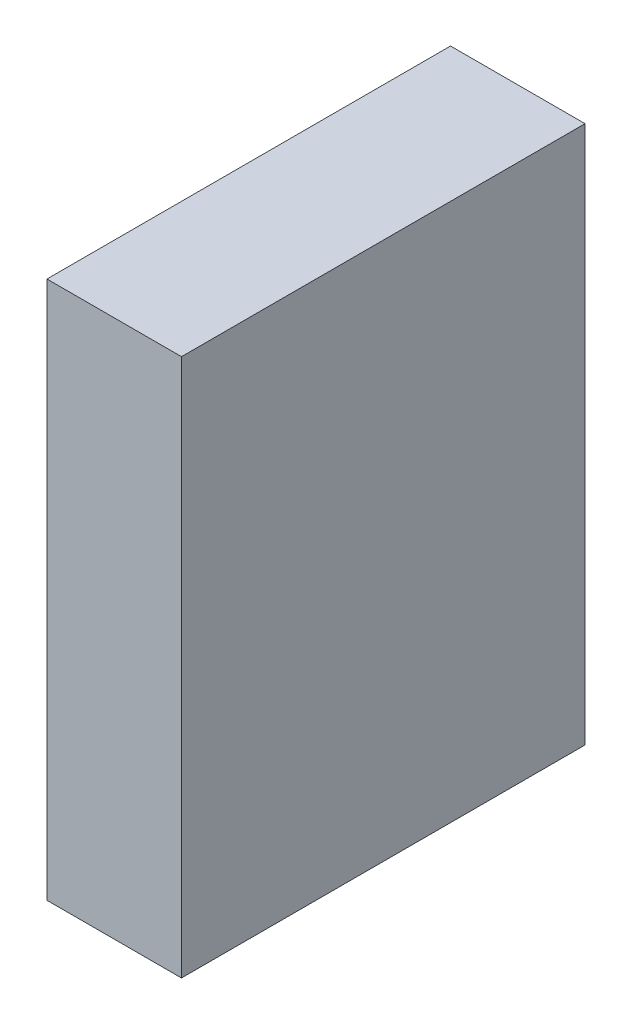
ISO-10303-21;
HEADER;
FILE_DESCRIPTION(('STEP AP214'),'2;1');
FILE_NAME('part.step','',(''),(''),'','','');
FILE_SCHEMA(('AUTOMOTIVE_DESIGN { 1 0 10303 214 1 1 1 1 }'));
ENDSEC;
DATA;
#1=APPLICATION_CONTEXT('core data for automotive mechanical design processes');
#2=APPLICATION_PROTOCOL_DEFINITION('international standard','automotive_design',2000,#1);
#3=PRODUCT_CONTEXT('',#1,'mechanical');
#4=PRODUCT('Part','Part','',(#3));
#5=PRODUCT_RELATED_PRODUCT_CATEGORY('part','',(#4));
#6=PRODUCT_DEFINITION_FORMATION('','',#4);
#7=PRODUCT_DEFINITION_CONTEXT('part definition',#1,'design');
#8=PRODUCT_DEFINITION('design','',#6,#7);
#9=PRODUCT_DEFINITION_SHAPE('','',#8);
#10=(LENGTH_UNIT() NAMED_UNIT(*) SI_UNIT(.MILLI.,.METRE.));
#11=(NAMED_UNIT(*) PLANE_ANGLE_UNIT() SI_UNIT($,.RADIAN.));
#12=(NAMED_UNIT(*) SI_UNIT($,.STERADIAN.) SOLID_ANGLE_UNIT());
#13=UNCERTAINTY_MEASURE_WITH_UNIT(LENGTH_MEASURE(1.E-05),#10,'distance_accuracy_value','');
#14=(GEOMETRIC_REPRESENTATION_CONTEXT(3) GLOBAL_UNCERTAINTY_ASSIGNED_CONTEXT((#13)) GLOBAL_UNIT_ASSIGNED_CONTEXT((#10,
#11,#12)) REPRESENTATION_CONTEXT('',''));
#15=CARTESIAN_POINT('',(0.,0.,0.));
#16=DIRECTION('',(0.,0.,1.));
#17=DIRECTION('',(1.,0.,0.));
#18=AXIS2_PLACEMENT_3D('',#15,#16,#17);
#19=CARTESIAN_POINT('',(125.,500.,750.));
#20=DIRECTION('',(0.,-1.,0.));
#21=DIRECTION('',(0.,0.,-1.));
#22=AXIS2_PLACEMENT_3D('',#19,#20,#21);
#23=PLANE('',#22);
#24=DIRECTION('',(-1.,0.,0.));
#25=VECTOR('',#24,1.);
#26=CARTESIAN_POINT('',(125.,500.,0.));
#27=LINE('',#26,#25);
#28=CARTESIAN_POINT('',(125.,500.,0.));
#29=VERTEX_POINT('',#28);
#30=CARTESIAN_POINT('',(-125.,500.,0.));
#31=VERTEX_POINT('',#30);
#32=EDGE_CURVE('E105',#29,#31,#27,.T.);
#33=ORIENTED_EDGE('',*,*,#32,.T.);
#34=DIRECTION('',(0.,0.,-1.));
#35=VECTOR('',#34,1.);
#36=CARTESIAN_POINT('',(-125.,500.,750.));
#37=LINE('',#36,#35);
#38=CARTESIAN_POINT('',(-125.,500.,750.));
#39=VERTEX_POINT('',#38);
#40=EDGE_CURVE('E11',#39,#31,#37,.T.);
#41=ORIENTED_EDGE('',*,*,#40,.F.);
#42=DIRECTION('',(-1.,0.,0.));
#43=VECTOR('',#42,1.);
#44=CARTESIAN_POINT('',(125.,500.,750.));
#45=LINE('',#44,#43);
#46=CARTESIAN_POINT('',(125.,500.,750.));
#47=VERTEX_POINT('',#46);
#48=EDGE_CURVE('E89',#47,#39,#45,.T.);
#49=ORIENTED_EDGE('',*,*,#48,.F.);
#50=DIRECTION('',(0.,0.,-1.));
#51=VECTOR('',#50,1.);
#52=CARTESIAN_POINT('',(125.,500.,750.));
#53=LINE('',#52,#51);
#54=EDGE_CURVE('E97',#47,#29,#53,.T.);
#55=ORIENTED_EDGE('',*,*,#54,.T.);
#56=EDGE_LOOP('',(#33,#41,#49,#55));
#57=FACE_BOUND('',#56,.T.);
#58=ADVANCED_FACE('F39',(#57),#23,.F.);
#59=CARTESIAN_POINT('',(-125.,-500.,750.));
#60=DIRECTION('',(1.,0.,0.));
#61=DIRECTION('',(0.,0.,-1.));
#62=AXIS2_PLACEMENT_3D('',#59,#60,#61);
#63=PLANE('',#62);
#64=DIRECTION('',(0.,-1.,0.));
#65=VECTOR('',#64,1.);
#66=CARTESIAN_POINT('',(-125.,-500.,0.));
#67=LINE('',#66,#65);
#68=CARTESIAN_POINT('',(-125.,-500.,0.));
#69=VERTEX_POINT('',#68);
#70=EDGE_CURVE('E92',#31,#69,#67,.T.);
#71=ORIENTED_EDGE('',*,*,#70,.T.);
#72=DIRECTION('',(0.,0.,-1.));
#73=VECTOR('',#72,1.);
#74=CARTESIAN_POINT('',(-125.,-500.,750.));
#75=LINE('',#74,#73);
#76=CARTESIAN_POINT('',(-125.,-500.,750.));
#77=VERTEX_POINT('',#76);
#78=EDGE_CURVE('E50',#77,#69,#75,.T.);
#79=ORIENTED_EDGE('',*,*,#78,.F.);
#80=DIRECTION('',(0.,-1.,0.));
#81=VECTOR('',#80,1.);
#82=CARTESIAN_POINT('',(-125.,-500.,750.));
#83=LINE('',#82,#81);
#84=EDGE_CURVE('E82',#39,#77,#83,.T.);
#85=ORIENTED_EDGE('',*,*,#84,.F.);
#86=ORIENTED_EDGE('',*,*,#40,.T.);
#87=EDGE_LOOP('',(#71,#79,#85,#86));
#88=FACE_BOUND('',#87,.T.);
#89=ADVANCED_FACE('F93',(#88),#63,.F.);
#90=CARTESIAN_POINT('',(125.,-500.,750.));
#91=DIRECTION('',(0.,1.,0.));
#92=DIRECTION('',(0.,0.,1.));
#93=AXIS2_PLACEMENT_3D('',#90,#91,#92);
#94=PLANE('',#93);
#95=DIRECTION('',(1.,0.,0.));
#96=VECTOR('',#95,1.);
#97=CARTESIAN_POINT('',(125.,-500.,0.));
#98=LINE('',#97,#96);
#99=CARTESIAN_POINT('',(125.,-500.,0.));
#100=VERTEX_POINT('',#99);
#101=EDGE_CURVE('E75',#69,#100,#98,.T.);
#102=ORIENTED_EDGE('',*,*,#101,.T.);
#103=DIRECTION('',(0.,0.,-1.));
#104=VECTOR('',#103,1.);
#105=CARTESIAN_POINT('',(125.,-500.,750.));
#106=LINE('',#105,#104);
#107=CARTESIAN_POINT('',(125.,-500.,750.));
#108=VERTEX_POINT('',#107);
#109=EDGE_CURVE('E94',#108,#100,#106,.T.);
#110=ORIENTED_EDGE('',*,*,#109,.F.);
#111=DIRECTION('',(1.,0.,0.));
#112=VECTOR('',#111,1.);
#113=CARTESIAN_POINT('',(125.,-500.,750.));
#114=LINE('',#113,#112);
#115=EDGE_CURVE('E88',#77,#108,#114,.T.);
#116=ORIENTED_EDGE('',*,*,#115,.F.);
#117=ORIENTED_EDGE('',*,*,#78,.T.);
#118=EDGE_LOOP('',(#102,#110,#116,#117));
#119=FACE_BOUND('',#118,.T.);
#120=ADVANCED_FACE('F96',(#119),#94,.F.);
#121=CARTESIAN_POINT('',(125.,-500.,750.));
#122=DIRECTION('',(-1.,0.,0.));
#123=DIRECTION('',(0.,0.,1.));
#124=AXIS2_PLACEMENT_3D('',#121,#122,#123);
#125=PLANE('',#124);
#126=DIRECTION('',(0.,1.,0.));
#127=VECTOR('',#126,1.);
#128=CARTESIAN_POINT('',(125.,-500.,0.));
#129=LINE('',#128,#127);
#130=EDGE_CURVE('E76',#100,#29,#129,.T.);
#131=ORIENTED_EDGE('',*,*,#130,.T.);
#132=ORIENTED_EDGE('',*,*,#54,.F.);
#133=DIRECTION('',(0.,1.,0.));
#134=VECTOR('',#133,1.);
#135=CARTESIAN_POINT('',(125.,-500.,750.));
#136=LINE('',#135,#134);
#137=EDGE_CURVE('E54',#108,#47,#136,.T.);
#138=ORIENTED_EDGE('',*,*,#137,.F.);
#139=ORIENTED_EDGE('',*,*,#109,.T.);
#140=EDGE_LOOP('',(#131,#132,#138,#139));
#141=FACE_BOUND('',#140,.T.);
#142=ADVANCED_FACE('F107',(#141),#125,.F.);
#143=CARTESIAN_POINT('',(0.,0.,750.));
#144=DIRECTION('',(0.,0.,-1.));
#145=DIRECTION('',(-1.,0.,0.));
#146=AXIS2_PLACEMENT_3D('',#143,#144,#145);
#147=PLANE('',#146);
#148=ORIENTED_EDGE('',*,*,#48,.T.);
#149=ORIENTED_EDGE('',*,*,#84,.T.);
#150=ORIENTED_EDGE('',*,*,#115,.T.);
#151=ORIENTED_EDGE('',*,*,#137,.T.);
#152=EDGE_LOOP('',(#148,#149,#150,#151));
#153=FACE_BOUND('',#152,.T.);
#154=ADVANCED_FACE('F86',(#153),#147,.F.);
#155=CARTESIAN_POINT('',(0.,0.,0.));
#156=DIRECTION('',(0.,0.,-1.));
#157=DIRECTION('',(-1.,0.,0.));
#158=AXIS2_PLACEMENT_3D('',#155,#156,#157);
#159=PLANE('',#158);
#160=ORIENTED_EDGE('',*,*,#32,.F.);
#161=ORIENTED_EDGE('',*,*,#130,.F.);
#162=ORIENTED_EDGE('',*,*,#101,.F.);
#163=ORIENTED_EDGE('',*,*,#70,.F.);
#164=EDGE_LOOP('',(#160,#161,#162,#163));
#165=FACE_BOUND('',#164,.T.);
#166=ADVANCED_FACE('F115',(#165),#159,.T.);
#167=CLOSED_SHELL('',(#58,#89,#120,#142,#154,#166));
#168=MANIFOLD_SOLID_BREP('B2',#167);
#169=ADVANCED_BREP_SHAPE_REPRESENTATION('',(#18,#168),#14);
#170=SHAPE_DEFINITION_REPRESENTATION(#9,#169);
ENDSEC;
END-ISO-10303-21;
